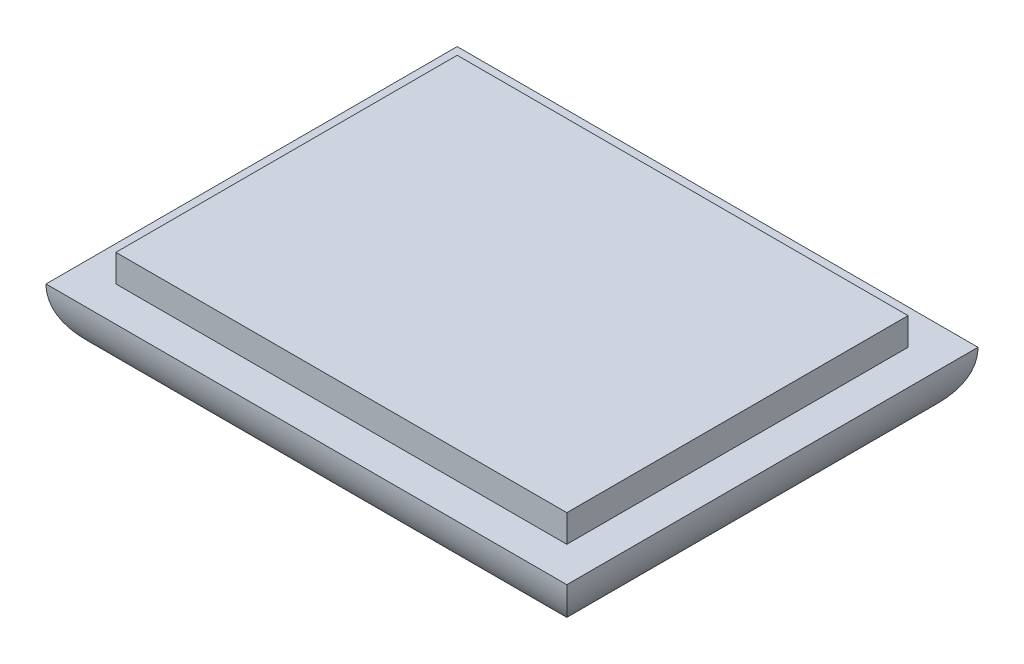
ISO-10303-21;
HEADER;
FILE_DESCRIPTION(('STEP AP214'),'2;1');
FILE_NAME('part.step','',(''),(''),'','','');
FILE_SCHEMA(('AUTOMOTIVE_DESIGN { 1 0 10303 214 1 1 1 1 }'));
ENDSEC;
DATA;
#1=APPLICATION_CONTEXT('core data for automotive mechanical design processes');
#2=APPLICATION_PROTOCOL_DEFINITION('international standard','automotive_design',2000,#1);
#3=PRODUCT_CONTEXT('',#1,'mechanical');
#4=PRODUCT('Part','Part','',(#3));
#5=PRODUCT_RELATED_PRODUCT_CATEGORY('part','',(#4));
#6=PRODUCT_DEFINITION_FORMATION('','',#4);
#7=PRODUCT_DEFINITION_CONTEXT('part definition',#1,'design');
#8=PRODUCT_DEFINITION('design','',#6,#7);
#9=PRODUCT_DEFINITION_SHAPE('','',#8);
#10=(LENGTH_UNIT() NAMED_UNIT(*) SI_UNIT(.MILLI.,.METRE.));
#11=(NAMED_UNIT(*) PLANE_ANGLE_UNIT() SI_UNIT($,.RADIAN.));
#12=(NAMED_UNIT(*) SI_UNIT($,.STERADIAN.) SOLID_ANGLE_UNIT());
#13=UNCERTAINTY_MEASURE_WITH_UNIT(LENGTH_MEASURE(1.E-05),#10,'distance_accuracy_value','');
#14=(GEOMETRIC_REPRESENTATION_CONTEXT(3) GLOBAL_UNCERTAINTY_ASSIGNED_CONTEXT((#13)) GLOBAL_UNIT_ASSIGNED_CONTEXT((#10,
#11,#12)) REPRESENTATION_CONTEXT('',''));
#15=CARTESIAN_POINT('',(0.,0.,0.));
#16=DIRECTION('',(0.,0.,1.));
#17=DIRECTION('',(1.,0.,0.));
#18=AXIS2_PLACEMENT_3D('',#15,#16,#17);
#19=CARTESIAN_POINT('',(-16.45,7.,12.45));
#20=DIRECTION('',(1.,0.,0.));
#21=DIRECTION('',(0.,0.,-1.));
#22=AXIS2_PLACEMENT_3D('',#19,#20,#21);
#23=PLANE('',#22);
#24=DIRECTION('',(0.,0.,1.));
#25=VECTOR('',#24,1.);
#26=CARTESIAN_POINT('',(-16.45,5.,12.45));
#27=LINE('',#26,#25);
#28=CARTESIAN_POINT('',(-16.45,5.,-12.45));
#29=VERTEX_POINT('',#28);
#30=CARTESIAN_POINT('',(-16.45,5.,12.45));
#31=VERTEX_POINT('',#30);
#32=EDGE_CURVE('E109',#29,#31,#27,.T.);
#33=ORIENTED_EDGE('',*,*,#32,.T.);
#34=DIRECTION('',(0.,-1.,0.));
#35=VECTOR('',#34,1.);
#36=CARTESIAN_POINT('',(-16.45,7.,12.45));
#37=LINE('',#36,#35);
#38=CARTESIAN_POINT('',(-16.45,7.,12.45));
#39=VERTEX_POINT('',#38);
#40=EDGE_CURVE('E12',#39,#31,#37,.T.);
#41=ORIENTED_EDGE('',*,*,#40,.F.);
#42=DIRECTION('',(0.,0.,1.));
#43=VECTOR('',#42,1.);
#44=CARTESIAN_POINT('',(-16.45,7.,12.45));
#45=LINE('',#44,#43);
#46=CARTESIAN_POINT('',(-16.45,7.,-12.45));
#47=VERTEX_POINT('',#46);
#48=EDGE_CURVE('E97',#47,#39,#45,.T.);
#49=ORIENTED_EDGE('',*,*,#48,.F.);
#50=DIRECTION('',(0.,-1.,0.));
#51=VECTOR('',#50,1.);
#52=CARTESIAN_POINT('',(-16.45,7.,-12.45));
#53=LINE('',#52,#51);
#54=EDGE_CURVE('E105',#47,#29,#53,.T.);
#55=ORIENTED_EDGE('',*,*,#54,.T.);
#56=EDGE_LOOP('',(#33,#41,#49,#55));
#57=FACE_BOUND('',#56,.T.);
#58=ADVANCED_FACE('F46',(#57),#23,.F.);
#59=CARTESIAN_POINT('',(16.45,7.,12.45));
#60=DIRECTION('',(0.,0.,-1.));
#61=DIRECTION('',(-1.,0.,0.));
#62=AXIS2_PLACEMENT_3D('',#59,#60,#61);
#63=PLANE('',#62);
#64=DIRECTION('',(1.,0.,0.));
#65=VECTOR('',#64,1.);
#66=CARTESIAN_POINT('',(16.45,5.,12.45));
#67=LINE('',#66,#65);
#68=CARTESIAN_POINT('',(16.45,5.,12.45));
#69=VERTEX_POINT('',#68);
#70=EDGE_CURVE('E101',#31,#69,#67,.T.);
#71=ORIENTED_EDGE('',*,*,#70,.T.);
#72=DIRECTION('',(0.,-1.,0.));
#73=VECTOR('',#72,1.);
#74=CARTESIAN_POINT('',(16.45,7.,12.45));
#75=LINE('',#74,#73);
#76=CARTESIAN_POINT('',(16.45,7.,12.45));
#77=VERTEX_POINT('',#76);
#78=EDGE_CURVE('E54',#77,#69,#75,.T.);
#79=ORIENTED_EDGE('',*,*,#78,.F.);
#80=DIRECTION('',(1.,0.,0.));
#81=VECTOR('',#80,1.);
#82=CARTESIAN_POINT('',(16.45,7.,12.45));
#83=LINE('',#82,#81);
#84=EDGE_CURVE('E92',#39,#77,#83,.T.);
#85=ORIENTED_EDGE('',*,*,#84,.F.);
#86=ORIENTED_EDGE('',*,*,#40,.T.);
#87=EDGE_LOOP('',(#71,#79,#85,#86));
#88=FACE_BOUND('',#87,.T.);
#89=ADVANCED_FACE('F100',(#88),#63,.F.);
#90=CARTESIAN_POINT('',(16.45,7.,12.45));
#91=DIRECTION('',(-1.,0.,0.));
#92=DIRECTION('',(0.,0.,1.));
#93=AXIS2_PLACEMENT_3D('',#90,#91,#92);
#94=PLANE('',#93);
#95=DIRECTION('',(0.,0.,-1.));
#96=VECTOR('',#95,1.);
#97=CARTESIAN_POINT('',(16.45,5.,12.45));
#98=LINE('',#97,#96);
#99=CARTESIAN_POINT('',(16.45,5.,-12.45));
#100=VERTEX_POINT('',#99);
#101=EDGE_CURVE('E79',#69,#100,#98,.T.);
#102=ORIENTED_EDGE('',*,*,#101,.T.);
#103=DIRECTION('',(0.,-1.,0.));
#104=VECTOR('',#103,1.);
#105=CARTESIAN_POINT('',(16.45,7.,-12.45));
#106=LINE('',#105,#104);
#107=CARTESIAN_POINT('',(16.45,7.,-12.45));
#108=VERTEX_POINT('',#107);
#109=EDGE_CURVE('E102',#108,#100,#106,.T.);
#110=ORIENTED_EDGE('',*,*,#109,.F.);
#111=DIRECTION('',(0.,0.,-1.));
#112=VECTOR('',#111,1.);
#113=CARTESIAN_POINT('',(16.45,7.,12.45));
#114=LINE('',#113,#112);
#115=EDGE_CURVE('E95',#77,#108,#114,.T.);
#116=ORIENTED_EDGE('',*,*,#115,.F.);
#117=ORIENTED_EDGE('',*,*,#78,.T.);
#118=EDGE_LOOP('',(#102,#110,#116,#117));
#119=FACE_BOUND('',#118,.T.);
#120=ADVANCED_FACE('F103',(#119),#94,.F.);
#121=CARTESIAN_POINT('',(16.45,7.,-12.45));
#122=DIRECTION('',(0.,0.,1.));
#123=DIRECTION('',(1.,0.,0.));
#124=AXIS2_PLACEMENT_3D('',#121,#122,#123);
#125=PLANE('',#124);
#126=DIRECTION('',(-1.,0.,0.));
#127=VECTOR('',#126,1.);
#128=CARTESIAN_POINT('',(16.45,5.,-12.45));
#129=LINE('',#128,#127);
#130=EDGE_CURVE('E85',#100,#29,#129,.T.);
#131=ORIENTED_EDGE('',*,*,#130,.T.);
#132=ORIENTED_EDGE('',*,*,#54,.F.);
#133=DIRECTION('',(-1.,0.,0.));
#134=VECTOR('',#133,1.);
#135=CARTESIAN_POINT('',(16.45,7.,-12.45));
#136=LINE('',#135,#134);
#137=EDGE_CURVE('E62',#108,#47,#136,.T.);
#138=ORIENTED_EDGE('',*,*,#137,.F.);
#139=ORIENTED_EDGE('',*,*,#109,.T.);
#140=EDGE_LOOP('',(#131,#132,#138,#139));
#141=FACE_BOUND('',#140,.T.);
#142=ADVANCED_FACE('F116',(#141),#125,.F.);
#143=CARTESIAN_POINT('',(0.,7.,0.));
#144=DIRECTION('',(0.,1.,0.));
#145=DIRECTION('',(0.,0.,1.));
#146=AXIS2_PLACEMENT_3D('',#143,#144,#145);
#147=PLANE('',#146);
#148=ORIENTED_EDGE('',*,*,#48,.T.);
#149=ORIENTED_EDGE('',*,*,#84,.T.);
#150=ORIENTED_EDGE('',*,*,#115,.T.);
#151=ORIENTED_EDGE('',*,*,#137,.T.);
#152=EDGE_LOOP('',(#148,#149,#150,#151));
#153=FACE_BOUND('',#152,.T.);
#154=ADVANCED_FACE('F93',(#153),#147,.T.);
#155=CARTESIAN_POINT('',(0.,5.,0.));
#156=DIRECTION('',(0.,1.,0.));
#157=DIRECTION('',(0.,0.,1.));
#158=AXIS2_PLACEMENT_3D('',#155,#156,#157);
#159=PLANE('',#158);
#160=ORIENTED_EDGE('',*,*,#32,.F.);
#161=ORIENTED_EDGE('',*,*,#130,.F.);
#162=ORIENTED_EDGE('',*,*,#101,.F.);
#163=ORIENTED_EDGE('',*,*,#70,.F.);
#164=EDGE_LOOP('',(#160,#161,#162,#163));
#165=FACE_BOUND('',#164,.T.);
#166=ADVANCED_FACE('F119',(#165),#159,.F.);
#167=CLOSED_SHELL('',(#58,#89,#120,#142,#154,#166));
#168=MANIFOLD_SOLID_BREP('B2',#167);
#169=CARTESIAN_POINT('',(0.,5.,0.));
#170=DIRECTION('',(0.,-1.,0.));
#171=DIRECTION('',(0.,0.,-1.));
#172=AXIS2_PLACEMENT_3D('',#169,#170,#171);
#173=PLANE('',#172);
#174=DIRECTION('',(-1.,0.,0.));
#175=VECTOR('',#174,1.);
#176=CARTESIAN_POINT('',(19.,5.,-15.));
#177=LINE('',#176,#175);
#178=CARTESIAN_POINT('',(19.,5.,-15.));
#179=VERTEX_POINT('',#178);
#180=CARTESIAN_POINT('',(-19.,5.,-15.));
#181=VERTEX_POINT('',#180);
#182=EDGE_CURVE('E210',#179,#181,#177,.T.);
#183=ORIENTED_EDGE('',*,*,#182,.T.);
#184=DIRECTION('',(0.,0.,-1.));
#185=VECTOR('',#184,1.);
#186=CARTESIAN_POINT('',(-19.,5.,15.));
#187=LINE('',#186,#185);
#188=CARTESIAN_POINT('',(-19.,5.,15.));
#189=VERTEX_POINT('',#188);
#190=EDGE_CURVE('E212',#189,#181,#187,.T.);
#191=ORIENTED_EDGE('',*,*,#190,.F.);
#192=DIRECTION('',(-1.,0.,0.));
#193=VECTOR('',#192,1.);
#194=CARTESIAN_POINT('',(19.,5.,15.));
#195=LINE('',#194,#193);
#196=CARTESIAN_POINT('',(19.,5.,15.));
#197=VERTEX_POINT('',#196);
#198=EDGE_CURVE('E227',#197,#189,#195,.T.);
#199=ORIENTED_EDGE('',*,*,#198,.F.);
#200=DIRECTION('',(0.,0.,-1.));
#201=VECTOR('',#200,1.);
#202=CARTESIAN_POINT('',(19.,5.,15.));
#203=LINE('',#202,#201);
#204=EDGE_CURVE('E214',#197,#179,#203,.T.);
#205=ORIENTED_EDGE('',*,*,#204,.T.);
#206=EDGE_LOOP('',(#183,#191,#199,#205));
#207=FACE_BOUND('',#206,.T.);
#208=ADVANCED_FACE('F169',(#207),#173,.F.);
#209=CARTESIAN_POINT('',(0.,0.,0.));
#210=DIRECTION('',(0.,-1.,0.));
#211=DIRECTION('',(0.,0.,-1.));
#212=AXIS2_PLACEMENT_3D('',#209,#210,#211);
#213=PLANE('',#212);
#214=DIRECTION('',(-1.,0.,0.));
#215=VECTOR('',#214,1.);
#216=CARTESIAN_POINT('',(0.,0.,10.));
#217=LINE('',#216,#215);
#218=CARTESIAN_POINT('',(14.,0.,10.));
#219=VERTEX_POINT('',#218);
#220=CARTESIAN_POINT('',(-14.,0.,10.));
#221=VERTEX_POINT('',#220);
#222=EDGE_CURVE('E178',#219,#221,#217,.T.);
#223=ORIENTED_EDGE('',*,*,#222,.T.);
#224=DIRECTION('',(0.,0.,-1.));
#225=VECTOR('',#224,1.);
#226=CARTESIAN_POINT('',(-14.,0.,0.));
#227=LINE('',#226,#225);
#228=CARTESIAN_POINT('',(-14.,0.,-10.));
#229=VERTEX_POINT('',#228);
#230=EDGE_CURVE('E44',#221,#229,#227,.T.);
#231=ORIENTED_EDGE('',*,*,#230,.T.);
#232=DIRECTION('',(-1.,0.,0.));
#233=VECTOR('',#232,1.);
#234=CARTESIAN_POINT('',(19.,0.,-10.));
#235=LINE('',#234,#233);
#236=CARTESIAN_POINT('',(14.,0.,-10.));
#237=VERTEX_POINT('',#236);
#238=EDGE_CURVE('E230',#229,#237,#235,.F.);
#239=ORIENTED_EDGE('',*,*,#238,.T.);
#240=DIRECTION('',(0.,0.,-1.));
#241=VECTOR('',#240,1.);
#242=CARTESIAN_POINT('',(14.,0.,15.));
#243=LINE('',#242,#241);
#244=EDGE_CURVE('E189',#237,#219,#243,.F.);
#245=ORIENTED_EDGE('',*,*,#244,.T.);
#246=EDGE_LOOP('',(#223,#231,#239,#245));
#247=FACE_BOUND('',#246,.T.);
#248=ADVANCED_FACE('F243',(#247),#213,.T.);
#249=CARTESIAN_POINT('',(14.,5.,15.));
#250=DIRECTION('',(0.,0.,1.));
#251=DIRECTION('',(1.,0.,0.));
#252=AXIS2_PLACEMENT_3D('',#249,#250,#251);
#253=CYLINDRICAL_SURFACE('',#252,5.);
#254=CARTESIAN_POINT('',(14.,5.,-10.));
#255=DIRECTION('',(0.707106781186547,0.,0.707106781186547));
#256=DIRECTION('',(0.707106781186547,0.,-0.707106781186547));
#257=AXIS2_PLACEMENT_3D('',#254,#255,#256);
#258=ELLIPSE('',#257,7.07106781186547,5.);
#259=EDGE_CURVE('E232',#179,#237,#258,.F.);
#260=ORIENTED_EDGE('',*,*,#259,.F.);
#261=ORIENTED_EDGE('',*,*,#204,.F.);
#262=CARTESIAN_POINT('',(14.,5.,10.));
#263=DIRECTION('',(-0.707106781186547,0.,0.707106781186547));
#264=DIRECTION('',(0.707106781186547,0.,0.707106781186547));
#265=AXIS2_PLACEMENT_3D('',#262,#263,#264);
#266=ELLIPSE('',#265,7.07106781186547,5.);
#267=EDGE_CURVE('E173',#219,#197,#266,.T.);
#268=ORIENTED_EDGE('',*,*,#267,.F.);
#269=ORIENTED_EDGE('',*,*,#244,.F.);
#270=EDGE_LOOP('',(#260,#261,#268,#269));
#271=FACE_BOUND('',#270,.T.);
#272=ADVANCED_FACE('F171',(#271),#253,.T.);
#273=CARTESIAN_POINT('',(0.,5.,10.));
#274=DIRECTION('',(-1.,0.,0.));
#275=DIRECTION('',(0.,0.,1.));
#276=AXIS2_PLACEMENT_3D('',#273,#274,#275);
#277=CYLINDRICAL_SURFACE('',#276,5.);
#278=ORIENTED_EDGE('',*,*,#267,.T.);
#279=ORIENTED_EDGE('',*,*,#198,.T.);
#280=CARTESIAN_POINT('',(-14.,5.,10.));
#281=DIRECTION('',(-0.707106781186547,0.,-0.707106781186547));
#282=DIRECTION('',(-0.707106781186547,0.,0.707106781186547));
#283=AXIS2_PLACEMENT_3D('',#280,#281,#282);
#284=ELLIPSE('',#283,7.07106781186547,5.);
#285=EDGE_CURVE('E225',#221,#189,#284,.T.);
#286=ORIENTED_EDGE('',*,*,#285,.F.);
#287=ORIENTED_EDGE('',*,*,#222,.F.);
#288=EDGE_LOOP('',(#278,#279,#286,#287));
#289=FACE_BOUND('',#288,.T.);
#290=ADVANCED_FACE('F237',(#289),#277,.T.);
#291=CARTESIAN_POINT('',(19.,5.,-10.));
#292=DIRECTION('',(1.,0.,0.));
#293=DIRECTION('',(0.,0.,-1.));
#294=AXIS2_PLACEMENT_3D('',#291,#292,#293);
#295=CYLINDRICAL_SURFACE('',#294,5.);
#296=ORIENTED_EDGE('',*,*,#259,.T.);
#297=ORIENTED_EDGE('',*,*,#238,.F.);
#298=CARTESIAN_POINT('',(-14.,5.,-10.));
#299=DIRECTION('',(0.707106781186547,0.,-0.707106781186547));
#300=DIRECTION('',(0.707106781186547,0.,0.707106781186547));
#301=AXIS2_PLACEMENT_3D('',#298,#299,#300);
#302=ELLIPSE('',#301,7.07106781186547,5.);
#303=EDGE_CURVE('E223',#181,#229,#302,.F.);
#304=ORIENTED_EDGE('',*,*,#303,.F.);
#305=ORIENTED_EDGE('',*,*,#182,.F.);
#306=EDGE_LOOP('',(#296,#297,#304,#305));
#307=FACE_BOUND('',#306,.T.);
#308=ADVANCED_FACE('F229',(#307),#295,.T.);
#309=CARTESIAN_POINT('',(-14.,5.,0.));
#310=DIRECTION('',(0.,0.,-1.));
#311=DIRECTION('',(-1.,0.,0.));
#312=AXIS2_PLACEMENT_3D('',#309,#310,#311);
#313=CYLINDRICAL_SURFACE('',#312,5.);
#314=ORIENTED_EDGE('',*,*,#285,.T.);
#315=ORIENTED_EDGE('',*,*,#190,.T.);
#316=ORIENTED_EDGE('',*,*,#303,.T.);
#317=ORIENTED_EDGE('',*,*,#230,.F.);
#318=EDGE_LOOP('',(#314,#315,#316,#317));
#319=FACE_BOUND('',#318,.T.);
#320=ADVANCED_FACE('F221',(#319),#313,.T.);
#321=CLOSED_SHELL('',(#208,#248,#272,#290,#308,#320));
#322=MANIFOLD_SOLID_BREP('B6',#321);
#323=ADVANCED_BREP_SHAPE_REPRESENTATION('',(#18,#168,#322),#14);
#324=SHAPE_DEFINITION_REPRESENTATION(#9,#323);
ENDSEC;
END-ISO-10303-21;
